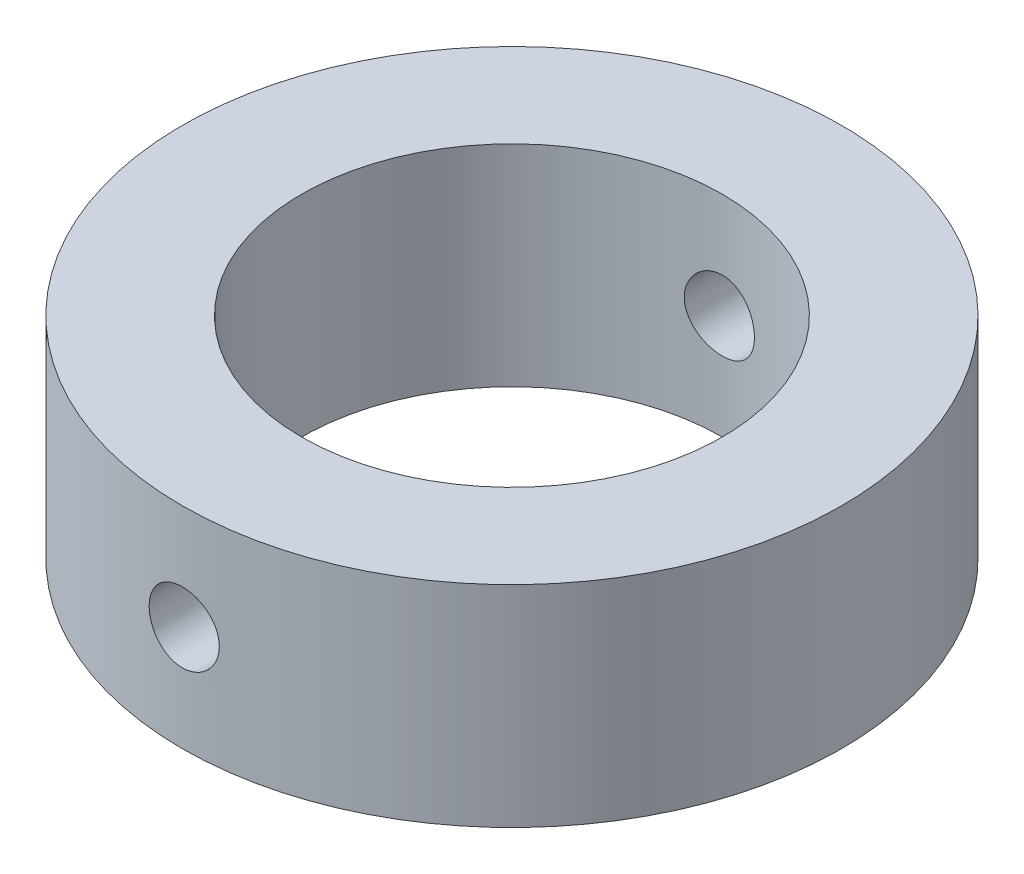
ISO-10303-21;
HEADER;
FILE_DESCRIPTION(('STEP AP214'),'2;1');
FILE_NAME('part.step','',(''),(''),'','','');
FILE_SCHEMA(('AUTOMOTIVE_DESIGN { 1 0 10303 214 1 1 1 1 }'));
ENDSEC;
DATA;
#1=APPLICATION_CONTEXT('core data for automotive mechanical design processes');
#2=APPLICATION_PROTOCOL_DEFINITION('international standard','automotive_design',2000,#1);
#3=PRODUCT_CONTEXT('',#1,'mechanical');
#4=PRODUCT('Part','Part','',(#3));
#5=PRODUCT_RELATED_PRODUCT_CATEGORY('part','',(#4));
#6=PRODUCT_DEFINITION_FORMATION('','',#4);
#7=PRODUCT_DEFINITION_CONTEXT('part definition',#1,'design');
#8=PRODUCT_DEFINITION('design','',#6,#7);
#9=PRODUCT_DEFINITION_SHAPE('','',#8);
#10=(LENGTH_UNIT() NAMED_UNIT(*) SI_UNIT(.MILLI.,.METRE.));
#11=(NAMED_UNIT(*) PLANE_ANGLE_UNIT() SI_UNIT($,.RADIAN.));
#12=(NAMED_UNIT(*) SI_UNIT($,.STERADIAN.) SOLID_ANGLE_UNIT());
#13=UNCERTAINTY_MEASURE_WITH_UNIT(LENGTH_MEASURE(1.E-05),#10,'distance_accuracy_value','');
#14=(GEOMETRIC_REPRESENTATION_CONTEXT(3) GLOBAL_UNCERTAINTY_ASSIGNED_CONTEXT((#13)) GLOBAL_UNIT_ASSIGNED_CONTEXT((#10,
#11,#12)) REPRESENTATION_CONTEXT('',''));
#15=CARTESIAN_POINT('',(0.,0.,0.));
#16=DIRECTION('',(0.,0.,1.));
#17=DIRECTION('',(1.,0.,0.));
#18=AXIS2_PLACEMENT_3D('',#15,#16,#17);
#19=CARTESIAN_POINT('',(0.,15.,0.));
#20=DIRECTION('',(0.,-1.,0.));
#21=DIRECTION('',(0.,0.,-1.));
#22=AXIS2_PLACEMENT_3D('',#19,#20,#21);
#23=CYLINDRICAL_SURFACE('',#22,23.5);
#24=CARTESIAN_POINT('',(-2.5,7.5,23.3666428910959));
#25=CARTESIAN_POINT('',(-2.49999395984692,7.36000085539677,23.3666446297366));
#26=CARTESIAN_POINT('',(-2.48820051956116,7.2199103279992,23.367914644454));
#27=CARTESIAN_POINT('',(-2.44133426049196,6.94361676773013,23.3728564960063));
#28=CARTESIAN_POINT('',(-2.40623609823167,6.8074181355979,23.3765309475609));
#29=CARTESIAN_POINT('',(-2.31379700244405,6.5429493158205,23.3858608597904));
#30=CARTESIAN_POINT('',(-2.25646993075487,6.41467424476108,23.391515085675));
#31=CARTESIAN_POINT('',(-2.12122770898041,6.16959328365958,23.4041659477928));
#32=CARTESIAN_POINT('',(-2.04331651388485,6.05278519628268,23.4111623260771));
#33=CARTESIAN_POINT('',(-1.86877517067324,5.83344877155844,23.4257412712972));
#34=CARTESIAN_POINT('',(-1.77207780020775,5.73097405823675,23.4333258827295));
#35=CARTESIAN_POINT('',(-1.5628529679189,5.54367538484997,23.4482081875829));
#36=CARTESIAN_POINT('',(-1.45032476775382,5.45885224850302,23.4555058676013));
#37=CARTESIAN_POINT('',(-1.21230165137124,5.30907725841867,23.4690124626765));
#38=CARTESIAN_POINT('',(-1.08677652341028,5.244173159828,23.4752187461873));
#39=CARTESIAN_POINT('',(-0.826532103209643,5.13638422234721,23.4858209580647));
#40=CARTESIAN_POINT('',(-0.691813062533144,5.09349878125762,23.4902169359415));
#41=CARTESIAN_POINT('',(-0.417548766893458,5.03112260584216,23.4966888642627));
#42=CARTESIAN_POINT('',(-0.278023824613528,5.01154348157647,23.4987735781694));
#43=CARTESIAN_POINT('',(0.00234614602399056,4.99606212118395,23.5004179235775));
#44=CARTESIAN_POINT('',(0.143191135876497,5.00015919656778,23.4999776285046));
#45=CARTESIAN_POINT('',(0.421602781868082,5.03184239925215,23.4966287180026));
#46=CARTESIAN_POINT('',(0.559180391494432,5.05933347778774,23.4937300908246));
#47=CARTESIAN_POINT('',(0.827757892495922,5.13687612332646,23.4858016458699));
#48=CARTESIAN_POINT('',(0.958757688838645,5.18692801617094,23.4807717973124));
#49=CARTESIAN_POINT('',(1.21075931305691,5.3082749787475,23.4691291196492));
#50=CARTESIAN_POINT('',(1.33174084277147,5.37961189095717,23.4625131776536));
#51=CARTESIAN_POINT('',(1.56005023887222,5.54147350584039,23.4484401738799));
#52=CARTESIAN_POINT('',(1.6673776515614,5.63199884583789,23.4409830841676));
#53=CARTESIAN_POINT('',(1.86588930078626,5.83020168053127,23.4260205016097));
#54=CARTESIAN_POINT('',(1.95699096106137,5.93796189595979,23.4185149519417));
#55=CARTESIAN_POINT('',(2.11982518137819,6.16728938597414,23.4043381238641));
#56=CARTESIAN_POINT('',(2.19155770689201,6.28885668517226,23.3976668469419));
#57=CARTESIAN_POINT('',(2.31361822870603,6.54241332007862,23.3859134970135));
#58=CARTESIAN_POINT('',(2.36394077004702,6.67440530170333,23.3808318291044));
#59=CARTESIAN_POINT('',(2.44168566701257,6.94503157132901,23.3728413376063));
#60=CARTESIAN_POINT('',(2.46910881445868,7.08366562948314,23.3699324388871));
#61=CARTESIAN_POINT('',(2.5001695268338,7.36291478578585,23.3666300441178));
#62=CARTESIAN_POINT('',(2.50392277627182,7.50351687753707,23.3662243142656));
#63=CARTESIAN_POINT('',(2.48784129837694,7.78334793916393,23.3679418969845));
#64=CARTESIAN_POINT('',(2.46800693259466,7.92257693005347,23.3700651707912));
#65=CARTESIAN_POINT('',(2.40541018305026,8.19537017250444,23.3765903852873));
#66=CARTESIAN_POINT('',(2.36270280757373,8.32894718856901,23.3809868581886));
#67=CARTESIAN_POINT('',(2.25562861046787,8.5870420893751,23.3915586673359));
#68=CARTESIAN_POINT('',(2.19126122966416,8.71155974013924,23.3977340495057));
#69=CARTESIAN_POINT('',(2.04240563634751,8.94852769391261,23.4111974143512));
#70=CARTESIAN_POINT('',(1.95784095089482,9.06092971730914,23.4184895869324));
#71=CARTESIAN_POINT('',(1.77110048303366,9.26998543957933,23.4333513138747));
#72=CARTESIAN_POINT('',(1.66892420672583,9.36663869664675,23.4409208760103));
#73=CARTESIAN_POINT('',(1.44935827525924,9.54185393893662,23.4555215730044));
#74=CARTESIAN_POINT('',(1.33190811646784,9.62034032699641,23.4625503794833));
#75=CARTESIAN_POINT('',(1.0854261552271,9.75647301365654,23.4752435080236));
#76=CARTESIAN_POINT('',(0.956394529523274,9.81411963022649,23.4809078509034));
#77=CARTESIAN_POINT('',(0.690673269036545,9.90680906540087,23.4902233660249));
#78=CARTESIAN_POINT('',(0.553999546231138,9.94189707948392,23.4938785613873));
#79=CARTESIAN_POINT('',(0.276659558793436,9.98862068757975,23.4987804977983));
#80=CARTESIAN_POINT('',(0.135993422355543,10.0002570337518,23.50002731609));
#81=CARTESIAN_POINT('',(-0.144596911701662,9.99973561157266,23.4999719013607));
#82=CARTESIAN_POINT('',(-0.284521344223526,9.98769501127687,23.4986822204881));
#83=CARTESIAN_POINT('',(-0.560347347214234,9.94040775695252,23.4937235159186));
#84=CARTESIAN_POINT('',(-0.696248915725512,9.90516109163186,23.490054491064));
#85=CARTESIAN_POINT('',(-0.96016707401824,9.81249574934289,23.4807479937134));
#86=CARTESIAN_POINT('',(-1.08818506594407,9.7550810283872,23.4751108724524));
#87=CARTESIAN_POINT('',(-1.33278605023515,9.61972169340796,23.4624955733761));
#88=CARTESIAN_POINT('',(-1.44936906119346,9.54177711276633,23.4555173977415));
#89=CARTESIAN_POINT('',(-1.66839094265341,9.3671323264587,23.4409597944045));
#90=CARTESIAN_POINT('',(-1.77076002806548,9.27034482561349,23.4333776692515));
#91=CARTESIAN_POINT('',(-1.95785386095198,9.06093697971063,23.418489299741));
#92=CARTESIAN_POINT('',(-2.04257438301435,8.94831285384067,23.4111831217927));
#93=CARTESIAN_POINT('',(-2.19216096639633,8.71007325823139,23.3976516924953));
#94=CARTESIAN_POINT('',(-2.25696991314464,8.58442177437951,23.3914295723671));
#95=CARTESIAN_POINT('',(-2.3644808357262,8.32403127665641,23.3808078455419));
#96=CARTESIAN_POINT('',(-2.40720753879993,8.18930261922494,23.3764062014219));
#97=CARTESIAN_POINT('',(-2.45878534536088,7.96152147070731,23.3710242385114));
#98=CARTESIAN_POINT('',(-2.47421946412865,7.86992103085135,23.3693890984272));
#99=CARTESIAN_POINT('',(-2.49482876811948,7.68556044102058,23.3671978511322));
#100=CARTESIAN_POINT('',(-2.50000400379588,7.59280029675145,23.3666417386147));
#101=CARTESIAN_POINT('',(-2.5,7.5,23.3666428910959));
#102=B_SPLINE_CURVE_WITH_KNOTS('',3,(#24,#25,#26,#27,#28,#29,#30,#31,#32,#33,#34,#35,#36,#37,
#38,#39,#40,#41,#42,#43,#44,#45,#46,#47,#48,#49,#50,#51,#52,#53,#54,#55,#56,#57,#58,#59,#60,#61,
#62,#63,#64,#65,#66,#67,#68,#69,#70,#71,#72,#73,#74,#75,#76,#77,#78,#79,#80,#81,#82,#83,#84,#85,
#86,#87,#88,#89,#90,#91,#92,#93,#94,#95,#96,#97,#98,#99,#100,#101),.UNSPECIFIED.,.T.,.F.,(4,2,2,
2,2,2,2,2,2,2,2,2,2,2,2,2,2,2,2,2,2,2,2,2,2,2,2,2,2,2,2,2,2,2,2,2,2,2,4),(0.,0.419658515723323,
0.839774151817853,1.25962822611099,1.67940168912752,2.10070584843259,2.52202966366423,
2.94435583520252,3.36667045571208,3.78737827935295,4.20807386913019,4.62706830838445,
5.04606879928573,5.46589845743231,5.8857420619763,6.30766481347114,6.72958831709064,
7.15161925652959,7.5736356022625,7.99358777204955,8.41353350489863,8.83247379764512,
9.25142490657797,9.67198816230179,10.0925632142188,10.5148581293251,10.9371466008568,
11.3585863717937,11.7800126257859,12.1993586518872,12.618704882043,13.037976312098,
13.4572470604144,13.8785085205697,14.2998707233528,14.7224305185161,15.1445161091162,
15.4226937110898,15.7008699449788),.UNSPECIFIED.);
#103=CARTESIAN_POINT('',(-2.5,7.5,23.3666428910959));
#104=VERTEX_POINT('',#103);
#105=EDGE_CURVE('E68',#104,#104,#102,.T.);
#106=ORIENTED_EDGE('',*,*,#105,.F.);
#107=EDGE_LOOP('',(#106));
#108=FACE_BOUND('',#107,.T.);
#109=CARTESIAN_POINT('',(0.,15.,0.));
#110=DIRECTION('',(0.,1.,0.));
#111=DIRECTION('',(0.,0.,1.));
#112=AXIS2_PLACEMENT_3D('',#109,#110,#111);
#113=CIRCLE('',#112,23.5);
#114=CARTESIAN_POINT('',(0.,15.,23.5));
#115=VERTEX_POINT('',#114);
#116=EDGE_CURVE('E10',#115,#115,#113,.T.);
#117=ORIENTED_EDGE('',*,*,#116,.F.);
#118=EDGE_LOOP('',(#117));
#119=FACE_BOUND('',#118,.T.);
#120=CARTESIAN_POINT('',(0.,0.,0.));
#121=DIRECTION('',(0.,1.,0.));
#122=DIRECTION('',(0.,0.,1.));
#123=AXIS2_PLACEMENT_3D('',#120,#121,#122);
#124=CIRCLE('',#123,23.5);
#125=CARTESIAN_POINT('',(0.,0.,23.5));
#126=VERTEX_POINT('',#125);
#127=EDGE_CURVE('E41',#126,#126,#124,.T.);
#128=ORIENTED_EDGE('',*,*,#127,.T.);
#129=EDGE_LOOP('',(#128));
#130=FACE_BOUND('',#129,.T.);
#131=CARTESIAN_POINT('',(0.,10.,-23.5));
#132=CARTESIAN_POINT('',(0.140001672045219,9.99999396209962,-23.4999982973895));
#133=CARTESIAN_POINT('',(0.280094719060372,9.98820011037619,-23.4987356311767));
#134=CARTESIAN_POINT('',(0.556393514309449,9.94133206851222,-23.4938200298327));
#135=CARTESIAN_POINT('',(0.692594863786342,9.90623254367867,-23.4901644935667));
#136=CARTESIAN_POINT('',(0.95706942988622,9.81378946208546,-23.4808756026513));
#137=CARTESIAN_POINT('',(1.08534750691586,9.75645970242015,-23.4752434749699));
#138=CARTESIAN_POINT('',(1.33043350645096,9.62121115028734,-23.4626303806656));
#139=CARTESIAN_POINT('',(1.44724363002306,9.54329631939055,-23.4556496736446));
#140=CARTESIAN_POINT('',(1.6665777626335,9.36875130047104,-23.4410891963472));
#141=CARTESIAN_POINT('',(1.76904879090472,9.27205470266107,-23.4335073585745));
#142=CARTESIAN_POINT('',(1.95634035004137,9.06283296390524,-23.4186161340808));
#143=CARTESIAN_POINT('',(2.04116004588221,8.95030707455118,-23.4113067602627));
#144=CARTESIAN_POINT('',(2.190931432583,8.71228598992775,-23.3977671662156));
#145=CARTESIAN_POINT('',(2.25583473797167,8.58676018548929,-23.3915395898016));
#146=CARTESIAN_POINT('',(2.36362202247759,8.32651429518925,-23.3808948054953));
#147=CARTESIAN_POINT('',(2.40650661313804,8.19179446479838,-23.3764775473242));
#148=CARTESIAN_POINT('',(2.46888101983662,7.91752772265389,-23.3699725356892));
#149=CARTESIAN_POINT('',(2.48845914860942,7.77800110724081,-23.3678759907233));
#150=CARTESIAN_POINT('',(2.50393793829164,7.49762785851811,-23.3662226029813));
#151=CARTESIAN_POINT('',(2.4998392985264,7.35678126431852,-23.3666656851939));
#152=CARTESIAN_POINT('',(2.46815361373513,7.07837650315654,-23.3700334546108));
#153=CARTESIAN_POINT('',(2.44066319242074,6.94080719840124,-23.372947933124));
#154=CARTESIAN_POINT('',(2.36312473792475,6.67224596761622,-23.3809141699109));
#155=CARTESIAN_POINT('',(2.31307636399617,6.54125414097517,-23.3859659604696));
#156=CARTESIAN_POINT('',(2.19173669848156,6.28926219840144,-23.3976493253519));
#157=CARTESIAN_POINT('',(2.12040274519676,6.1682827778342,-23.404284066907));
#158=CARTESIAN_POINT('',(1.95854745140575,5.93997634620065,-23.4183831500386));
#159=CARTESIAN_POINT('',(1.86802547501257,5.83264978777593,-23.425847519105));
#160=CARTESIAN_POINT('',(1.66982503269356,5.63413435907268,-23.4408102857327));
#161=CARTESIAN_POINT('',(1.562063157647,5.54302874361849,-23.4483086671025));
#162=CARTESIAN_POINT('',(1.33273093557358,5.38018733301048,-23.4624594695044));
#163=CARTESIAN_POINT('',(1.21116056979917,5.30845156415522,-23.4691118893878));
#164=CARTESIAN_POINT('',(0.957603090607631,5.18638870662557,-23.4808238313146));
#165=CARTESIAN_POINT('',(0.825613815944417,5.1360660736925,-23.4858830217747));
#166=CARTESIAN_POINT('',(0.554993432268586,5.05832016464432,-23.4938351939587));
#167=CARTESIAN_POINT('',(0.416362548299694,5.03089611321506,-23.4967282490245));
#168=CARTESIAN_POINT('',(0.137114889982357,4.99983198957598,-23.5000127360981));
#169=CARTESIAN_POINT('',(-0.00348897324143081,4.99607707876291,-23.5004162467447));
#170=CARTESIAN_POINT('',(-0.283323976434181,5.01215586618401,-23.4987086209798));
#171=CARTESIAN_POINT('',(-0.422555137405012,5.0319892029597,-23.4965975231014));
#172=CARTESIAN_POINT('',(-0.695359283567303,5.09458618485256,-23.4901055682477));
#173=CARTESIAN_POINT('',(-0.828944797894515,5.13729582811078,-23.4857300574693));
#174=CARTESIAN_POINT('',(-1.08705569247648,5.24437740551998,-23.4751998963319));
#175=CARTESIAN_POINT('',(-1.21158084436789,5.30874988544547,-23.4690452011486));
#176=CARTESIAN_POINT('',(-1.44855394517772,5.45761300433795,-23.4556144487126));
#177=CARTESIAN_POINT('',(-1.56095442910164,5.54217882128753,-23.4483342378532));
#178=CARTESIAN_POINT('',(-1.77000651852883,5.72892064833888,-23.4334820577784));
#179=CARTESIAN_POINT('',(-1.86665767542738,5.83109715989414,-23.4259100802599));
#180=CARTESIAN_POINT('',(-2.04186832785339,6.05066218209825,-23.4112912109734));
#181=CARTESIAN_POINT('',(-2.12035227409583,6.16811115309356,-23.4042465915309));
#182=CARTESIAN_POINT('',(-2.25648067732186,6.41459008270442,-23.3915153248769));
#183=CARTESIAN_POINT('',(-2.31412545142663,6.54361986505107,-23.3858286570012));
#184=CARTESIAN_POINT('',(-2.40681367932151,6.80934224732913,-23.3764716892343));
#185=CARTESIAN_POINT('',(-2.44190153018097,6.94601921562921,-23.372797430596));
#186=CARTESIAN_POINT('',(-2.48862371228334,7.223366052069,-23.3678692406321));
#187=CARTESIAN_POINT('',(-2.50025881307394,7.36403578904165,-23.3666152298917));
#188=CARTESIAN_POINT('',(-2.49973373624157,7.64462402608966,-23.366671349595));
#189=CARTESIAN_POINT('',(-2.48769223460911,7.7845427658697,-23.3679686917093));
#190=CARTESIAN_POINT('',(-2.44040517922356,8.06035715706667,-23.3729540196644));
#191=CARTESIAN_POINT('',(-2.40515960415433,8.19625280478772,-23.3766420077013));
#192=CARTESIAN_POINT('',(-2.31249870012741,8.46015901729205,-23.3859894423117));
#193=CARTESIAN_POINT('',(-2.25508739250627,8.5881710074572,-23.3916485312672));
#194=CARTESIAN_POINT('',(-2.1197367439649,8.83276141104398,-23.4043012272856));
#195=CARTESIAN_POINT('',(-2.04179742973973,8.94933983933378,-23.411294832613));
#196=CARTESIAN_POINT('',(-1.8671584620111,9.16836192543994,-23.4258705791235));
#197=CARTESIAN_POINT('',(-1.77037030707783,9.27073484073673,-23.4334553913102));
#198=CARTESIAN_POINT('',(-1.56095957354722,9.45783609546696,-23.4483346898668));
#199=CARTESIAN_POINT('',(-1.44833322279793,9.54256021955996,-23.4556291065413));
#200=CARTESIAN_POINT('',(-1.21009178822928,9.69215071002201,-23.4691274353275));
#201=CARTESIAN_POINT('',(-1.08444109160406,9.75696060088937,-23.4753282251784));
#202=CARTESIAN_POINT('',(-0.824052258186872,9.86447350617777,-23.4859074197107));
#203=CARTESIAN_POINT('',(-0.689324472467045,9.9072012353893,-23.4902878606816));
#204=CARTESIAN_POINT('',(-0.46154058261996,9.9587819123749,-23.495642534066));
#205=CARTESIAN_POINT('',(-0.36993632703508,9.97421732321859,-23.4972688848913));
#206=CARTESIAN_POINT('',(-0.185568094207448,9.99482834350467,-23.4994481795837));
#207=CARTESIAN_POINT('',(-0.0928041225562801,10.0000040023954,-23.5000011286242));
#208=CARTESIAN_POINT('',(0.,10.,-23.5));
#209=B_SPLINE_CURVE_WITH_KNOTS('',3,(#131,#132,#133,#134,#135,#136,#137,#138,#139,#140,#141,
#142,#143,#144,#145,#146,#147,#148,#149,#150,#151,#152,#153,#154,#155,#156,#157,#158,#159,#160,
#161,#162,#163,#164,#165,#166,#167,#168,#169,#170,#171,#172,#173,#174,#175,#176,#177,#178,#179,
#180,#181,#182,#183,#184,#185,#186,#187,#188,#189,#190,#191,#192,#193,#194,#195,#196,#197,#198,
#199,#200,#201,#202,#203,#204,#205,#206,#207,#208),.UNSPECIFIED.,.T.,.F.,(4,2,2,2,2,2,2,2,2,2,2,
2,2,2,2,2,2,2,2,2,2,2,2,2,2,2,2,2,2,2,2,2,2,2,2,2,2,2,4),(0.,0.419666107818814,
0.839789166900037,1.25965189478724,1.67943387941125,2.10072810302217,2.52204225210417,
2.94437199555594,3.36669000867469,3.78740263036789,4.20810282580893,4.62707363704623,
5.04605077721848,5.46587335957817,5.88570985694413,6.30764268798729,6.72957609188856,
7.15159725070066,7.57360411988332,7.9935618981369,8.41351324117996,8.83247758721581,
9.25145248944921,9.67201220784835,10.0925839034008,10.5148743473018,10.9371583647054,
11.3586086672652,11.7800451406838,12.1993746012433,12.6187044470151,13.0379582531317,
13.4572115140444,13.8784829523417,14.2998548944936,14.7224110205387,15.1444931836235,
15.4226822369718,15.7008699495454),.UNSPECIFIED.);
#210=CARTESIAN_POINT('',(0.,10.,-23.5));
#211=VERTEX_POINT('',#210);
#212=EDGE_CURVE('E72',#211,#211,#209,.T.);
#213=ORIENTED_EDGE('',*,*,#212,.F.);
#214=EDGE_LOOP('',(#213));
#215=FACE_BOUND('',#214,.T.);
#216=ADVANCED_FACE('F29',(#108,#119,#130,#215),#23,.T.);
#217=CARTESIAN_POINT('',(0.,15.,0.));
#218=DIRECTION('',(0.,-1.,0.));
#219=DIRECTION('',(0.,0.,-1.));
#220=AXIS2_PLACEMENT_3D('',#217,#218,#219);
#221=CYLINDRICAL_SURFACE('',#220,15.);
#222=CARTESIAN_POINT('',(-2.5,7.5,14.790199457749));
#223=CARTESIAN_POINT('',(-2.49999439841983,7.36062425183819,14.790201973666));
#224=CARTESIAN_POINT('',(-2.48830516902828,7.22117239392853,14.7921909238523));
#225=CARTESIAN_POINT('',(-2.44187742806638,6.94618145673683,14.7999245720004));
#226=CARTESIAN_POINT('',(-2.40711766030861,6.81064610624193,14.8056727334637));
#227=CARTESIAN_POINT('',(-2.31562954367049,6.54750771665839,14.8202560936731));
#228=CARTESIAN_POINT('',(-2.25891955493199,6.41989815133775,14.8290887118401));
#229=CARTESIAN_POINT('',(-2.12518649688947,6.17601904528222,14.8488427210228));
#230=CARTESIAN_POINT('',(-2.04816571350133,6.05974823042267,14.8597638769423));
#231=CARTESIAN_POINT('',(-1.87518752696654,5.84068715025544,14.8825847115588));
#232=CARTESIAN_POINT('',(-1.77906904893234,5.73802486861378,14.8944921732795));
#233=CARTESIAN_POINT('',(-1.57097200469527,5.55020669313819,14.9178748066858));
#234=CARTESIAN_POINT('',(-1.45899249914997,5.46505183688458,14.9293499527173));
#235=CARTESIAN_POINT('',(-1.22152286994836,5.31418543278073,14.9506573698271));
#236=CARTESIAN_POINT('',(-1.09595608145671,5.2485929922682,14.9604794243234));
#237=CARTESIAN_POINT('',(-0.835395621723868,5.13947892946945,14.9772873695709));
#238=CARTESIAN_POINT('',(-0.700402564078188,5.09595587211512,14.9842734447266));
#239=CARTESIAN_POINT('',(-0.426143726344242,5.0326074650161,14.994567347244));
#240=CARTESIAN_POINT('',(-0.28692888667927,5.01256708399531,14.9979085311091));
#241=CARTESIAN_POINT('',(-0.00707528552579655,4.9960842458474,15.0006507934278));
#242=CARTESIAN_POINT('',(0.133563378528899,4.99964018475277,15.0000521396931));
#243=CARTESIAN_POINT('',(0.410802185078877,5.03008135152821,14.9950085843139));
#244=CARTESIAN_POINT('',(0.547428530700142,5.05673516340915,14.990601836924));
#245=CARTESIAN_POINT('',(0.814241979611792,5.13225107424649,14.9784797877164));
#246=CARTESIAN_POINT('',(0.944428886651505,5.1811138495895,14.9707643851321));
#247=CARTESIAN_POINT('',(1.19535614778265,5.29989064031532,14.9528269851196));
#248=CARTESIAN_POINT('',(1.31605052301905,5.36990001208244,14.9425936732688));
#249=CARTESIAN_POINT('',(1.54406552984664,5.52891282263505,14.920757380715));
#250=CARTESIAN_POINT('',(1.65138507791588,5.61791779871082,14.9091542891913));
#251=CARTESIAN_POINT('',(1.85097127344667,5.81367880661931,14.885702682326));
#252=CARTESIAN_POINT('',(1.94303950225321,5.92063709490098,14.8738528973104));
#253=CARTESIAN_POINT('',(2.10795458844806,6.14858709021582,14.8513795978481));
#254=CARTESIAN_POINT('',(2.18080126853242,6.26957892668282,14.8407560947132));
#255=CARTESIAN_POINT('',(2.30524443448829,6.52239164187748,14.8219375456182));
#256=CARTESIAN_POINT('',(2.35681702727924,6.65422449809209,14.813745233026));
#257=CARTESIAN_POINT('',(2.43702987081562,6.92484907230754,14.8007618868988));
#258=CARTESIAN_POINT('',(2.46567214076796,7.06364017643242,14.7959705538832));
#259=CARTESIAN_POINT('',(2.49893188487927,7.34246615616213,14.7903895942212));
#260=CARTESIAN_POINT('',(2.50383220791244,7.4824663797021,14.7895528575867));
#261=CARTESIAN_POINT('',(2.49022270268246,7.76128667169082,14.7918503478236));
#262=CARTESIAN_POINT('',(2.47171377862467,7.90010678551397,14.7949844213185));
#263=CARTESIAN_POINT('',(2.4120523349281,8.17172775919086,14.8048268745502));
#264=CARTESIAN_POINT('',(2.37104379064639,8.30456113987801,14.8115125191835));
#265=CARTESIAN_POINT('',(2.26769819019228,8.56147016627949,14.827685730055));
#266=CARTESIAN_POINT('',(2.20535985810094,8.6855452875509,14.8371734639058));
#267=CARTESIAN_POINT('',(2.06045667322923,8.92267459440611,14.8579912839739));
#268=CARTESIAN_POINT('',(1.97771056415936,9.03561657275606,14.8693375560035));
#269=CARTESIAN_POINT('',(1.79458946570798,9.246113532695,14.8925466667987));
#270=CARTESIAN_POINT('',(1.69421323638404,9.34366743110974,14.9044095418533));
#271=CARTESIAN_POINT('',(1.47742807032881,9.5216518927287,14.9274642211826));
#272=CARTESIAN_POINT('',(1.3608632533862,9.60189382628454,14.9386477634467));
#273=CARTESIAN_POINT('',(1.11574344794933,9.74165532700488,14.9589511243294));
#274=CARTESIAN_POINT('',(0.987188847470627,9.80117556447385,14.9680710096998));
#275=CARTESIAN_POINT('',(0.722299051501328,9.89751058395487,14.9831835816958));
#276=CARTESIAN_POINT('',(0.586000562602611,9.93442407573492,14.9891898456762));
#277=CARTESIAN_POINT('',(0.309030734874211,9.98481559896383,14.9974558316928));
#278=CARTESIAN_POINT('',(0.168359756821621,9.99829555873235,14.9997158620019));
#279=CARTESIAN_POINT('',(-0.111541275773676,10.0013818823122,15.0002303788781));
#280=CARTESIAN_POINT('',(-0.250768160602665,9.99127525394108,14.9985330202419));
#281=CARTESIAN_POINT('',(-0.525511974314705,9.94809607773057,14.9914217838733));
#282=CARTESIAN_POINT('',(-0.661028923967479,9.91502365849033,14.9860079269518));
#283=CARTESIAN_POINT('',(-0.924396445918537,9.82696183445635,14.972069888274));
#284=CARTESIAN_POINT('',(-1.05225537215382,9.77199683178995,14.9635491704088));
#285=CARTESIAN_POINT('',(-1.29698045298217,9.64174206376942,14.9443275687803));
#286=CARTESIAN_POINT('',(-1.41384608611822,9.56645133493755,14.9336265816741));
#287=CARTESIAN_POINT('',(-1.63471294552639,9.3966649075395,14.9110762961641));
#288=CARTESIAN_POINT('',(-1.73855143060275,9.30195904524874,14.8992152454112));
#289=CARTESIAN_POINT('',(-1.92896387595091,9.09647169209619,14.8757630331437));
#290=CARTESIAN_POINT('',(-2.0155337867119,8.98568644108747,14.8641719354951));
#291=CARTESIAN_POINT('',(-2.16951427091086,8.75025467751038,14.8424834353391));
#292=CARTESIAN_POINT('',(-2.2367849890577,8.62551566023451,14.8323971784578));
#293=CARTESIAN_POINT('',(-2.34931453640427,8.36639076416185,14.8149921009131));
#294=CARTESIAN_POINT('',(-2.39459535522307,8.23201467732263,14.8076705172488));
#295=CARTESIAN_POINT('',(-2.45202605312742,7.99759623051261,14.7982474485649));
#296=CARTESIAN_POINT('',(-2.46998741767139,7.89897319203739,14.7952462341947));
#297=CARTESIAN_POINT('',(-2.49397629518131,7.70024651516306,14.7912213528807));
#298=CARTESIAN_POINT('',(-2.50000402479277,7.6001429036758,14.7901976500369));
#299=CARTESIAN_POINT('',(-2.5,7.5,14.790199457749));
#300=B_SPLINE_CURVE_WITH_KNOTS('',3,(#222,#223,#224,#225,#226,#227,#228,#229,#230,#231,#232,
#233,#234,#235,#236,#237,#238,#239,#240,#241,#242,#243,#244,#245,#246,#247,#248,#249,#250,#251,
#252,#253,#254,#255,#256,#257,#258,#259,#260,#261,#262,#263,#264,#265,#266,#267,#268,#269,#270,
#271,#272,#273,#274,#275,#276,#277,#278,#279,#280,#281,#282,#283,#284,#285,#286,#287,#288,#289,
#290,#291,#292,#293,#294,#295,#296,#297,#298,#299),.UNSPECIFIED.,.T.,.F.,(4,2,2,2,2,2,2,2,2,2,2,
2,2,2,2,2,2,2,2,2,2,2,2,2,2,2,2,2,2,2,2,2,2,2,2,2,2,2,4),(0.,0.417761038927741,0.83590751996297,
1.25370499787519,1.67145547405274,2.09289159155715,2.51435267834447,2.93832980111435,
3.36227935111113,3.78231567472565,4.20232344652692,4.61817121164669,5.03403164249533,
5.45179604139425,5.86959426226764,6.29246123462123,6.71533210746019,7.13867662498604,
7.56198385938077,7.9802354242041,8.39847083413976,8.81406064635492,9.22967532293575,
9.64912342762702,10.0686010443069,10.4924411303538,10.916267504767,11.3382298441765,
11.7601574591235,12.1769777626592,12.5937957321882,13.0101503983246,13.4265248039234,
13.8476699746325,14.2689137888181,14.6931372761832,15.1169356674445,15.4171067054376,
15.7172722940182),.UNSPECIFIED.);
#301=CARTESIAN_POINT('',(-2.5,7.5,14.790199457749));
#302=VERTEX_POINT('',#301);
#303=EDGE_CURVE('E51',#302,#302,#300,.T.);
#304=ORIENTED_EDGE('',*,*,#303,.T.);
#305=EDGE_LOOP('',(#304));
#306=FACE_BOUND('',#305,.T.);
#307=CARTESIAN_POINT('',(0.,15.,0.));
#308=DIRECTION('',(0.,1.,0.));
#309=DIRECTION('',(0.,0.,1.));
#310=AXIS2_PLACEMENT_3D('',#307,#308,#309);
#311=CIRCLE('',#310,15.);
#312=CARTESIAN_POINT('',(0.,15.,15.));
#313=VERTEX_POINT('',#312);
#314=EDGE_CURVE('E46',#313,#313,#311,.T.);
#315=ORIENTED_EDGE('',*,*,#314,.T.);
#316=EDGE_LOOP('',(#315));
#317=FACE_BOUND('',#316,.T.);
#318=CARTESIAN_POINT('',(0.,0.,0.));
#319=DIRECTION('',(0.,1.,0.));
#320=DIRECTION('',(0.,0.,1.));
#321=AXIS2_PLACEMENT_3D('',#318,#319,#320);
#322=CIRCLE('',#321,15.);
#323=CARTESIAN_POINT('',(0.,0.,15.));
#324=VERTEX_POINT('',#323);
#325=EDGE_CURVE('E49',#324,#324,#322,.T.);
#326=ORIENTED_EDGE('',*,*,#325,.F.);
#327=EDGE_LOOP('',(#326));
#328=FACE_BOUND('',#327,.T.);
#329=CARTESIAN_POINT('',(0.,10.,-15.));
#330=CARTESIAN_POINT('',(0.139390904958215,9.99999441105218,-14.9999976116882));
#331=CARTESIAN_POINT('',(0.278857881838821,9.98830272503108,-14.9980367791303));
#332=CARTESIAN_POINT('',(0.553880221673043,9.94186434123467,-14.9904034494139));
#333=CARTESIAN_POINT('',(0.689431867959247,9.9070964430884,-14.9847275392389));
#334=CARTESIAN_POINT('',(0.952604747212644,9.81558455140724,-14.9703006823645));
#335=CARTESIAN_POINT('',(1.0802323684319,9.75885853435943,-14.9615522515919));
#336=CARTESIAN_POINT('',(1.32414184197795,9.6250877079476,-14.9419422708207));
#337=CARTESIAN_POINT('',(1.44042498987859,9.548045222517,-14.9310809625443));
#338=CARTESIAN_POINT('',(1.65947261429168,9.37504491617954,-14.9083331745831));
#339=CARTESIAN_POINT('',(1.76211290353497,9.27893088536387,-14.8964387181486));
#340=CARTESIAN_POINT('',(1.94988849865993,9.07085203152719,-14.8730262687673));
#341=CARTESIAN_POINT('',(2.03502269939097,8.95888620854339,-14.8615082996267));
#342=CARTESIAN_POINT('',(2.18586712560513,8.72142903380294,-14.8400756575978));
#343=CARTESIAN_POINT('',(2.251454552861,8.59585866319524,-14.8301712909164));
#344=CARTESIAN_POINT('',(2.36055836541122,8.33529043569937,-14.8131978979467));
#345=CARTESIAN_POINT('',(2.40407624156561,8.20029321632237,-14.8061286801431));
#346=CARTESIAN_POINT('',(2.46741437778481,7.92601972514346,-14.7957053684276));
#347=CARTESIAN_POINT('',(2.4874490291354,7.78679426349861,-14.792317684857));
#348=CARTESIAN_POINT('',(2.50391672528988,7.50691972311653,-14.7895393893665));
#349=CARTESIAN_POINT('',(2.500351440389,7.3662707458327,-14.7901484945721));
#350=CARTESIAN_POINT('',(2.46989509839615,7.08907213872455,-14.7952642886356));
#351=CARTESIAN_POINT('',(2.44324488188977,6.95249519645477,-14.7997307331892));
#352=CARTESIAN_POINT('',(2.36775314040345,6.68577868217087,-14.8119949521101));
#353=CARTESIAN_POINT('',(2.31891085431974,6.55563933111145,-14.8197928407327));
#354=CARTESIAN_POINT('',(2.20017724609391,6.30477117655908,-14.837884793341));
#355=CARTESIAN_POINT('',(2.13018591387971,6.18409059391877,-14.8481906710733));
#356=CARTESIAN_POINT('',(1.97121201755743,5.95609559946161,-14.8701291841501));
#357=CARTESIAN_POINT('',(1.88222792065429,5.84878226754507,-14.8817619265429));
#358=CARTESIAN_POINT('',(1.68648221215905,5.64917391419265,-14.9052202787979));
#359=CARTESIAN_POINT('',(1.57951396387313,5.55708148145992,-14.9170464923165));
#360=CARTESIAN_POINT('',(1.35153524898165,5.39212223733466,-14.9394260139672));
#361=CARTESIAN_POINT('',(1.23052469190642,5.31925554981677,-14.9499793138975));
#362=CARTESIAN_POINT('',(0.97770591616671,5.19479777286372,-14.9686389289291));
#363=CARTESIAN_POINT('',(0.84588872556466,5.14322458066874,-14.9767431840745));
#364=CARTESIAN_POINT('',(0.57529834560273,5.06300578475402,-14.9895750301266));
#365=CARTESIAN_POINT('',(0.436525739179467,5.03435826302628,-14.9943029035047));
#366=CARTESIAN_POINT('',(0.157709901301623,5.00107864153886,-14.9998112984269));
#367=CARTESIAN_POINT('',(0.0177007371510101,4.99616842819439,-15.0006375301278));
#368=CARTESIAN_POINT('',(-0.261139772889889,5.00976134442812,-14.9983747442117));
#369=CARTESIAN_POINT('',(-0.39997116389204,5.02826357313374,-14.9952858772412));
#370=CARTESIAN_POINT('',(-0.671656175546765,5.08792484933548,-14.985568269382));
#371=CARTESIAN_POINT('',(-0.804540868385381,5.12894620839012,-14.9789610480131));
#372=CARTESIAN_POINT('',(-1.06154688486044,5.23233451819953,-14.9629446445536));
#373=CARTESIAN_POINT('',(-1.18566771590972,5.29470266763527,-14.9535353051202));
#374=CARTESIAN_POINT('',(-1.42283068946896,5.43965112469679,-14.9328451630241));
#375=CARTESIAN_POINT('',(-1.53576525093715,5.52240515616725,-14.9215485588702));
#376=CARTESIAN_POINT('',(-1.74624358550269,5.70553731538506,-14.898384673919));
#377=CARTESIAN_POINT('',(-1.84378623969658,5.80591672327667,-14.8865173517155));
#378=CARTESIAN_POINT('',(-2.021742779658,6.02269754807142,-14.8634017523585));
#379=CARTESIAN_POINT('',(-2.10196876111372,6.13925416551441,-14.8521611613711));
#380=CARTESIAN_POINT('',(-2.24170231029499,6.38435296913854,-14.8317152977788));
#381=CARTESIAN_POINT('',(-2.30121053476982,6.5128947752275,-14.8225099606602));
#382=CARTESIAN_POINT('',(-2.39753833147315,6.77778973281213,-14.807234536977));
#383=CARTESIAN_POINT('',(-2.43445143254795,6.91410809503049,-14.8011515431106));
#384=CARTESIAN_POINT('',(-2.48483545377828,7.19112012922176,-14.7927771683526));
#385=CARTESIAN_POINT('',(-2.49830841194617,7.33181341973205,-14.7904854578272));
#386=CARTESIAN_POINT('',(-2.50137286604735,7.61170516596241,-14.7899673308401));
#387=CARTESIAN_POINT('',(-2.49126013612519,7.75090037857529,-14.7916905650565));
#388=CARTESIAN_POINT('',(-2.44807983895685,8.02557924805077,-14.7988978145373));
#389=CARTESIAN_POINT('',(-2.41501234611248,8.16106291694187,-14.8043818176121));
#390=CARTESIAN_POINT('',(-2.3269744895949,8.42435843729261,-14.8184735628172));
#391=CARTESIAN_POINT('',(-2.27202959060044,8.55217901005603,-14.8270776721967));
#392=CARTESIAN_POINT('',(-2.14182700391591,8.79683566919485,-14.8464436892221));
#393=CARTESIAN_POINT('',(-2.06656830874856,8.91367121037214,-14.857205703884));
#394=CARTESIAN_POINT('',(-1.89681888437215,9.13453558310776,-14.8798345404562));
#395=CARTESIAN_POINT('',(-1.80211056359365,9.23839601670027,-14.891712955763));
#396=CARTESIAN_POINT('',(-1.59660903138023,9.42885160447494,-14.9151437236084));
#397=CARTESIAN_POINT('',(-1.48581211291264,9.51544276863817,-14.9266960002655));
#398=CARTESIAN_POINT('',(-1.25036916964028,9.66944826819995,-14.9482652964222));
#399=CARTESIAN_POINT('',(-1.12563278753282,9.73672603931295,-14.958271162531));
#400=CARTESIAN_POINT('',(-0.86651306937898,9.84926948460992,-14.9755116760178));
#401=CARTESIAN_POINT('',(-0.732139494830008,9.8945570810797,-14.9827490817748));
#402=CARTESIAN_POINT('',(-0.497703310045399,9.95200527412667,-14.9920579083296));
#403=CARTESIAN_POINT('',(-0.399058830298446,9.96997446961596,-14.9950202727336));
#404=CARTESIAN_POINT('',(-0.200289310319809,9.99397373784475,-14.9989921598612));
#405=CARTESIAN_POINT('',(-0.100164295608494,10.0000040161374,-15.0000017162064));
#406=CARTESIAN_POINT('',(0.,10.,-15.));
#407=B_SPLINE_CURVE_WITH_KNOTS('',3,(#329,#330,#331,#332,#333,#334,#335,#336,#337,#338,#339,
#340,#341,#342,#343,#344,#345,#346,#347,#348,#349,#350,#351,#352,#353,#354,#355,#356,#357,#358,
#359,#360,#361,#362,#363,#364,#365,#366,#367,#368,#369,#370,#371,#372,#373,#374,#375,#376,#377,
#378,#379,#380,#381,#382,#383,#384,#385,#386,#387,#388,#389,#390,#391,#392,#393,#394,#395,#396,
#397,#398,#399,#400,#401,#402,#403,#404,#405,#406),.UNSPECIFIED.,.T.,.F.,(4,2,2,2,2,2,2,2,2,2,2,
2,2,2,2,2,2,2,2,2,2,2,2,2,2,2,2,2,2,2,2,2,2,2,2,2,2,2,4),(0.,0.41780658493851,0.835997545695421,
1.25384686702527,1.67164841267479,2.09302491062332,2.51442800169857,2.9384252082384,
3.36239376876182,3.78246077103424,4.20249804320887,4.61820521760409,5.03392665025381,
5.45164556632558,5.86939820680574,6.29232769911327,6.71525991635848,7.13854688915904,
7.56179844521149,7.98007883491397,8.3983431303586,8.81407807006416,9.22983635826067,
9.64926825627024,10.0687306305428,10.4925382200762,10.9163323737594,11.3383602234177,
11.7603513778662,12.177079095227,12.5938054618813,13.0100481822622,13.4263115502934,
13.8475138419339,14.2688133387897,14.693022316072,15.1168075213007,15.4170424816402,
15.7172722727697),.UNSPECIFIED.);
#408=CARTESIAN_POINT('',(0.,10.,-15.));
#409=VERTEX_POINT('',#408);
#410=EDGE_CURVE('E33',#409,#409,#407,.T.);
#411=ORIENTED_EDGE('',*,*,#410,.T.);
#412=EDGE_LOOP('',(#411));
#413=FACE_BOUND('',#412,.T.);
#414=ADVANCED_FACE('F55',(#306,#317,#328,#413),#221,.F.);
#415=CARTESIAN_POINT('',(0.,15.,0.));
#416=DIRECTION('',(0.,1.,0.));
#417=DIRECTION('',(0.,0.,1.));
#418=AXIS2_PLACEMENT_3D('',#415,#416,#417);
#419=PLANE('',#418);
#420=ORIENTED_EDGE('',*,*,#116,.T.);
#421=EDGE_LOOP('',(#420));
#422=FACE_BOUND('',#421,.T.);
#423=ORIENTED_EDGE('',*,*,#314,.F.);
#424=EDGE_LOOP('',(#423));
#425=FACE_BOUND('',#424,.T.);
#426=ADVANCED_FACE('F86',(#422,#425),#419,.T.);
#427=CARTESIAN_POINT('',(0.,0.,0.));
#428=DIRECTION('',(0.,1.,0.));
#429=DIRECTION('',(0.,0.,1.));
#430=AXIS2_PLACEMENT_3D('',#427,#428,#429);
#431=PLANE('',#430);
#432=ORIENTED_EDGE('',*,*,#127,.F.);
#433=EDGE_LOOP('',(#432));
#434=FACE_BOUND('',#433,.T.);
#435=ORIENTED_EDGE('',*,*,#325,.T.);
#436=EDGE_LOOP('',(#435));
#437=FACE_BOUND('',#436,.T.);
#438=ADVANCED_FACE('F82',(#434,#437),#431,.F.);
#439=CARTESIAN_POINT('',(0.,7.5,46.));
#440=DIRECTION('',(0.,0.,-1.));
#441=DIRECTION('',(-1.,0.,0.));
#442=AXIS2_PLACEMENT_3D('',#439,#440,#441);
#443=CYLINDRICAL_SURFACE('',#442,2.5);
#444=ORIENTED_EDGE('',*,*,#303,.F.);
#445=EDGE_LOOP('',(#444));
#446=FACE_BOUND('',#445,.T.);
#447=ORIENTED_EDGE('',*,*,#105,.T.);
#448=EDGE_LOOP('',(#447));
#449=FACE_BOUND('',#448,.T.);
#450=ADVANCED_FACE('F61',(#446,#449),#443,.F.);
#451=ORIENTED_EDGE('',*,*,#410,.F.);
#452=EDGE_LOOP('',(#451));
#453=FACE_BOUND('',#452,.T.);
#454=ORIENTED_EDGE('',*,*,#212,.T.);
#455=EDGE_LOOP('',(#454));
#456=FACE_BOUND('',#455,.T.);
#457=ADVANCED_FACE('F58',(#453,#456),#443,.F.);
#458=CLOSED_SHELL('',(#216,#414,#426,#438,#450,#457));
#459=MANIFOLD_SOLID_BREP('B2',#458);
#460=ADVANCED_BREP_SHAPE_REPRESENTATION('',(#18,#459),#14);
#461=SHAPE_DEFINITION_REPRESENTATION(#9,#460);
ENDSEC;
END-ISO-10303-21;
